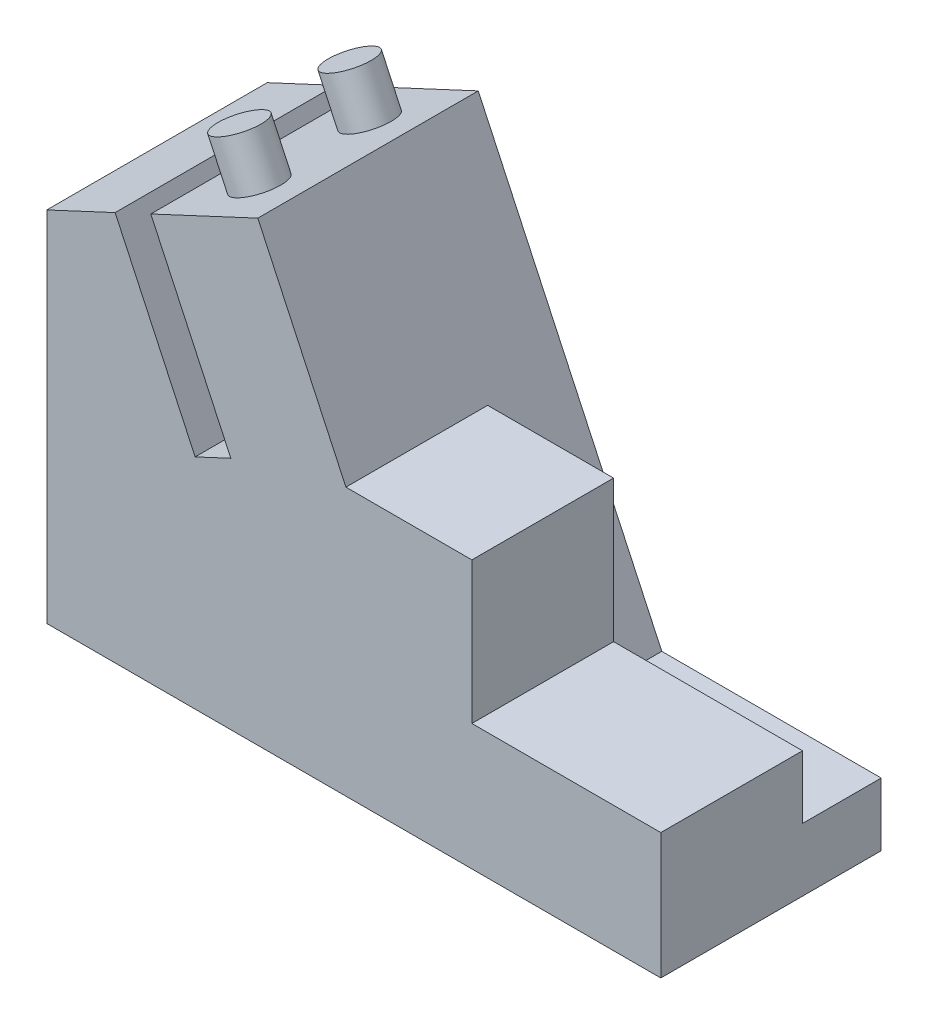
ISO-10303-21;
HEADER;
FILE_DESCRIPTION(('STEP AP214'),'2;1');
FILE_NAME('part.step','',(''),(''),'','','');
FILE_SCHEMA(('AUTOMOTIVE_DESIGN { 1 0 10303 214 1 1 1 1 }'));
ENDSEC;
DATA;
#1=APPLICATION_CONTEXT('core data for automotive mechanical design processes');
#2=APPLICATION_PROTOCOL_DEFINITION('international standard','automotive_design',2000,#1);
#3=PRODUCT_CONTEXT('',#1,'mechanical');
#4=PRODUCT('Part','Part','',(#3));
#5=PRODUCT_RELATED_PRODUCT_CATEGORY('part','',(#4));
#6=PRODUCT_DEFINITION_FORMATION('','',#4);
#7=PRODUCT_DEFINITION_CONTEXT('part definition',#1,'design');
#8=PRODUCT_DEFINITION('design','',#6,#7);
#9=PRODUCT_DEFINITION_SHAPE('','',#8);
#10=(LENGTH_UNIT() NAMED_UNIT(*) SI_UNIT(.MILLI.,.METRE.));
#11=(NAMED_UNIT(*) PLANE_ANGLE_UNIT() SI_UNIT($,.RADIAN.));
#12=(NAMED_UNIT(*) SI_UNIT($,.STERADIAN.) SOLID_ANGLE_UNIT());
#13=UNCERTAINTY_MEASURE_WITH_UNIT(LENGTH_MEASURE(1.E-05),#10,'distance_accuracy_value','');
#14=(GEOMETRIC_REPRESENTATION_CONTEXT(3) GLOBAL_UNCERTAINTY_ASSIGNED_CONTEXT((#13)) GLOBAL_UNIT_ASSIGNED_CONTEXT((#10,
#11,#12)) REPRESENTATION_CONTEXT('',''));
#15=CARTESIAN_POINT('',(0.,0.,0.));
#16=DIRECTION('',(0.,0.,1.));
#17=DIRECTION('',(1.,0.,0.));
#18=AXIS2_PLACEMENT_3D('',#15,#16,#17);
#19=CARTESIAN_POINT('',(0.,34.,-18.));
#20=DIRECTION('',(0.,1.,0.));
#21=DIRECTION('',(-1.,0.,0.));
#22=AXIS2_PLACEMENT_3D('',#19,#20,#21);
#23=PLANE('',#22);
#24=DIRECTION('',(-1.,0.,0.));
#25=VECTOR('',#24,1.);
#26=CARTESIAN_POINT('',(0.,34.,0.));
#27=LINE('',#26,#25);
#28=CARTESIAN_POINT('',(-24.,34.,0.));
#29=VERTEX_POINT('',#28);
#30=CARTESIAN_POINT('',(-40.,34.,0.));
#31=VERTEX_POINT('',#30);
#32=EDGE_CURVE('E124',#29,#31,#27,.T.);
#33=ORIENTED_EDGE('',*,*,#32,.F.);
#34=DIRECTION('',(0.,0.,1.));
#35=VECTOR('',#34,1.);
#36=CARTESIAN_POINT('',(-24.,34.,-18.));
#37=LINE('',#36,#35);
#38=CARTESIAN_POINT('',(-24.,34.,-18.));
#39=VERTEX_POINT('',#38);
#40=EDGE_CURVE('E47',#39,#29,#37,.T.);
#41=ORIENTED_EDGE('',*,*,#40,.F.);
#42=DIRECTION('',(-1.,0.,0.));
#43=VECTOR('',#42,1.);
#44=CARTESIAN_POINT('',(0.,34.,-18.));
#45=LINE('',#44,#43);
#46=CARTESIAN_POINT('',(-40.,34.,-18.));
#47=VERTEX_POINT('',#46);
#48=EDGE_CURVE('E104',#39,#47,#45,.T.);
#49=ORIENTED_EDGE('',*,*,#48,.T.);
#50=DIRECTION('',(0.,0.,1.));
#51=VECTOR('',#50,1.);
#52=CARTESIAN_POINT('',(-40.,34.,-18.));
#53=LINE('',#52,#51);
#54=EDGE_CURVE('E11',#47,#31,#53,.T.);
#55=ORIENTED_EDGE('',*,*,#54,.T.);
#56=EDGE_LOOP('',(#33,#41,#49,#55));
#57=FACE_BOUND('',#56,.T.);
#58=ADVANCED_FACE('F39',(#57),#23,.T.);
#59=CARTESIAN_POINT('',(-24.,0.,-18.));
#60=DIRECTION('',(1.,0.,0.));
#61=DIRECTION('',(0.,0.,-1.));
#62=AXIS2_PLACEMENT_3D('',#59,#60,#61);
#63=PLANE('',#62);
#64=DIRECTION('',(0.,1.,0.));
#65=VECTOR('',#64,1.);
#66=CARTESIAN_POINT('',(-24.,0.,0.));
#67=LINE('',#66,#65);
#68=CARTESIAN_POINT('',(-24.,16.,0.));
#69=VERTEX_POINT('',#68);
#70=EDGE_CURVE('E96',#69,#29,#67,.T.);
#71=ORIENTED_EDGE('',*,*,#70,.F.);
#72=DIRECTION('',(0.,0.,1.));
#73=VECTOR('',#72,1.);
#74=CARTESIAN_POINT('',(-24.,16.,-18.));
#75=LINE('',#74,#73);
#76=CARTESIAN_POINT('',(-24.,16.,-18.));
#77=VERTEX_POINT('',#76);
#78=EDGE_CURVE('E95',#77,#69,#75,.T.);
#79=ORIENTED_EDGE('',*,*,#78,.F.);
#80=DIRECTION('',(0.,1.,0.));
#81=VECTOR('',#80,1.);
#82=CARTESIAN_POINT('',(-24.,0.,-18.));
#83=LINE('',#82,#81);
#84=EDGE_CURVE('E92',#77,#39,#83,.T.);
#85=ORIENTED_EDGE('',*,*,#84,.T.);
#86=ORIENTED_EDGE('',*,*,#40,.T.);
#87=EDGE_LOOP('',(#71,#79,#85,#86));
#88=FACE_BOUND('',#87,.T.);
#89=ADVANCED_FACE('F94',(#88),#63,.T.);
#90=CARTESIAN_POINT('',(0.,16.,-18.));
#91=DIRECTION('',(0.,1.,0.));
#92=DIRECTION('',(-1.,0.,0.));
#93=AXIS2_PLACEMENT_3D('',#90,#91,#92);
#94=PLANE('',#93);
#95=DIRECTION('',(-1.,0.,0.));
#96=VECTOR('',#95,1.);
#97=CARTESIAN_POINT('',(0.,16.,0.));
#98=LINE('',#97,#96);
#99=CARTESIAN_POINT('',(0.,16.,0.));
#100=VERTEX_POINT('',#99);
#101=EDGE_CURVE('E120',#100,#69,#98,.T.);
#102=ORIENTED_EDGE('',*,*,#101,.F.);
#103=DIRECTION('',(0.,0.,1.));
#104=VECTOR('',#103,1.);
#105=CARTESIAN_POINT('',(0.,16.,-18.));
#106=LINE('',#105,#104);
#107=CARTESIAN_POINT('',(0.,16.,-18.));
#108=VERTEX_POINT('',#107);
#109=EDGE_CURVE('E43',#108,#100,#106,.T.);
#110=ORIENTED_EDGE('',*,*,#109,.F.);
#111=DIRECTION('',(-1.,0.,0.));
#112=VECTOR('',#111,1.);
#113=CARTESIAN_POINT('',(0.,16.,-18.));
#114=LINE('',#113,#112);
#115=EDGE_CURVE('E103',#108,#77,#114,.T.);
#116=ORIENTED_EDGE('',*,*,#115,.T.);
#117=ORIENTED_EDGE('',*,*,#78,.T.);
#118=EDGE_LOOP('',(#102,#110,#116,#117));
#119=FACE_BOUND('',#118,.T.);
#120=ADVANCED_FACE('F110',(#119),#94,.T.);
#121=CARTESIAN_POINT('',(0.,0.,-18.));
#122=DIRECTION('',(1.,0.,0.));
#123=DIRECTION('',(0.,0.,-1.));
#124=AXIS2_PLACEMENT_3D('',#121,#122,#123);
#125=PLANE('',#124);
#126=DIRECTION('',(0.,1.,0.));
#127=VECTOR('',#126,1.);
#128=CARTESIAN_POINT('',(0.,0.,0.));
#129=LINE('',#128,#127);
#130=CARTESIAN_POINT('',(0.,0.,0.));
#131=VERTEX_POINT('',#130);
#132=EDGE_CURVE('E111',#131,#100,#129,.T.);
#133=ORIENTED_EDGE('',*,*,#132,.F.);
#134=DIRECTION('',(0.,0.,1.));
#135=VECTOR('',#134,1.);
#136=CARTESIAN_POINT('',(0.,0.,-28.));
#137=LINE('',#136,#135);
#138=CARTESIAN_POINT('',(0.,0.,-28.));
#139=VERTEX_POINT('',#138);
#140=EDGE_CURVE('E153',#139,#131,#137,.T.);
#141=ORIENTED_EDGE('',*,*,#140,.F.);
#142=DIRECTION('',(0.,1.,0.));
#143=VECTOR('',#142,1.);
#144=CARTESIAN_POINT('',(0.,0.,-28.));
#145=LINE('',#144,#143);
#146=CARTESIAN_POINT('',(0.,8.,-28.));
#147=VERTEX_POINT('',#146);
#148=EDGE_CURVE('E190',#139,#147,#145,.T.);
#149=ORIENTED_EDGE('',*,*,#148,.T.);
#150=DIRECTION('',(0.,0.,1.));
#151=VECTOR('',#150,1.);
#152=CARTESIAN_POINT('',(0.,8.,-28.));
#153=LINE('',#152,#151);
#154=CARTESIAN_POINT('',(0.,8.,-18.));
#155=VERTEX_POINT('',#154);
#156=EDGE_CURVE('E156',#147,#155,#153,.T.);
#157=ORIENTED_EDGE('',*,*,#156,.T.);
#158=DIRECTION('',(0.,1.,0.));
#159=VECTOR('',#158,1.);
#160=CARTESIAN_POINT('',(0.,0.,-18.));
#161=LINE('',#160,#159);
#162=EDGE_CURVE('E107',#155,#108,#161,.T.);
#163=ORIENTED_EDGE('',*,*,#162,.T.);
#164=ORIENTED_EDGE('',*,*,#109,.T.);
#165=EDGE_LOOP('',(#133,#141,#149,#157,#163,#164));
#166=FACE_BOUND('',#165,.T.);
#167=ADVANCED_FACE('F41',(#166),#125,.T.);
#168=CARTESIAN_POINT('',(0.,0.,-18.));
#169=DIRECTION('',(0.,0.,1.));
#170=DIRECTION('',(1.,0.,0.));
#171=AXIS2_PLACEMENT_3D('',#168,#169,#170);
#172=PLANE('',#171);
#173=DIRECTION('',(0.422618261740704,-0.906307787036648,0.));
#174=VECTOR('',#173,1.);
#175=CARTESIAN_POINT('',(-19.8329966607079,-9.24827822705073,-18.));
#176=LINE('',#175,#174);
#177=CARTESIAN_POINT('',(-27.8760008879699,8.,-18.));
#178=VERTEX_POINT('',#177);
#179=EDGE_CURVE('E59',#47,#178,#176,.T.);
#180=ORIENTED_EDGE('',*,*,#179,.F.);
#181=ORIENTED_EDGE('',*,*,#48,.F.);
#182=ORIENTED_EDGE('',*,*,#84,.F.);
#183=ORIENTED_EDGE('',*,*,#115,.F.);
#184=ORIENTED_EDGE('',*,*,#162,.F.);
#185=DIRECTION('',(1.,0.,0.));
#186=VECTOR('',#185,1.);
#187=CARTESIAN_POINT('',(0.,8.,-18.));
#188=LINE('',#187,#186);
#189=EDGE_CURVE('E88',#178,#155,#188,.T.);
#190=ORIENTED_EDGE('',*,*,#189,.F.);
#191=EDGE_LOOP('',(#180,#181,#182,#183,#184,#190));
#192=FACE_BOUND('',#191,.T.);
#193=ADVANCED_FACE('F105',(#192),#172,.F.);
#194=CARTESIAN_POINT('',(0.,0.,0.));
#195=DIRECTION('',(0.,0.,1.));
#196=DIRECTION('',(1.,0.,0.));
#197=AXIS2_PLACEMENT_3D('',#194,#195,#196);
#198=PLANE('',#197);
#199=ORIENTED_EDGE('',*,*,#32,.T.);
#200=DIRECTION('',(0.422618261740704,-0.906307787036648,0.));
#201=VECTOR('',#200,1.);
#202=CARTESIAN_POINT('',(-19.8329966607079,-9.24827822705073,0.));
#203=LINE('',#202,#201);
#204=CARTESIAN_POINT('',(-51.1913837957201,58.,0.));
#205=VERTEX_POINT('',#204);
#206=EDGE_CURVE('E185',#205,#31,#203,.T.);
#207=ORIENTED_EDGE('',*,*,#206,.F.);
#208=DIRECTION('',(-0.906307787036648,-0.422618261740705,0.));
#209=VECTOR('',#208,1.);
#210=CARTESIAN_POINT('',(-31.3583871350123,67.2482782270507,0.));
#211=LINE('',#210,#209);
#212=CARTESIAN_POINT('',(-64.7860006012698,51.6607260738894,0.));
#213=VERTEX_POINT('',#212);
#214=EDGE_CURVE('E178',#205,#213,#211,.T.);
#215=ORIENTED_EDGE('',*,*,#214,.T.);
#216=DIRECTION('',(0.422618261740705,-0.906307787036648,0.));
#217=VECTOR('',#216,1.);
#218=CARTESIAN_POINT('',(-33.4276134662576,-15.5875521531613,0.));
#219=LINE('',#218,#217);
#220=CARTESIAN_POINT('',(-54.6226789554111,29.8654124689811,0.));
#221=VERTEX_POINT('',#220);
#222=EDGE_CURVE('E179',#213,#221,#219,.T.);
#223=ORIENTED_EDGE('',*,*,#222,.T.);
#224=DIRECTION('',(-0.906307787036647,-0.422618261740705,0.));
#225=VECTOR('',#224,1.);
#226=CARTESIAN_POINT('',(-21.1950654891536,45.4529646221424,0.));
#227=LINE('',#226,#225);
#228=CARTESIAN_POINT('',(-59.1542178905944,27.7523211602776,0.));
#229=VERTEX_POINT('',#228);
#230=EDGE_CURVE('E172',#221,#229,#227,.T.);
#231=ORIENTED_EDGE('',*,*,#230,.T.);
#232=DIRECTION('',(-0.422618261740705,0.906307787036647,0.));
#233=VECTOR('',#232,1.);
#234=CARTESIAN_POINT('',(-37.9591524014407,-17.7006434618648,0.));
#235=LINE('',#234,#233);
#236=CARTESIAN_POINT('',(-69.3175395364531,49.5476347651859,0.));
#237=VERTEX_POINT('',#236);
#238=EDGE_CURVE('E168',#229,#237,#235,.T.);
#239=ORIENTED_EDGE('',*,*,#238,.T.);
#240=DIRECTION('',(-0.906307787036647,-0.422618261740705,0.));
#241=VECTOR('',#240,1.);
#242=CARTESIAN_POINT('',(-31.3583871350124,67.2482782270507,0.));
#243=LINE('',#242,#241);
#244=CARTESIAN_POINT('',(-78.,45.4989369594059,0.));
#245=VERTEX_POINT('',#244);
#246=EDGE_CURVE('E170',#237,#245,#243,.T.);
#247=ORIENTED_EDGE('',*,*,#246,.T.);
#248=DIRECTION('',(0.,1.,0.));
#249=VECTOR('',#248,1.);
#250=CARTESIAN_POINT('',(-78.,0.,0.));
#251=LINE('',#250,#249);
#252=CARTESIAN_POINT('',(-78.,0.,0.));
#253=VERTEX_POINT('',#252);
#254=EDGE_CURVE('E163',#253,#245,#251,.T.);
#255=ORIENTED_EDGE('',*,*,#254,.F.);
#256=DIRECTION('',(-1.,0.,0.));
#257=VECTOR('',#256,1.);
#258=CARTESIAN_POINT('',(0.,0.,0.));
#259=LINE('',#258,#257);
#260=EDGE_CURVE('E159',#131,#253,#259,.T.);
#261=ORIENTED_EDGE('',*,*,#260,.F.);
#262=ORIENTED_EDGE('',*,*,#132,.T.);
#263=ORIENTED_EDGE('',*,*,#101,.T.);
#264=ORIENTED_EDGE('',*,*,#70,.T.);
#265=EDGE_LOOP('',(#199,#207,#215,#223,#231,#239,#247,#255,#261,#262,#263,#264));
#266=FACE_BOUND('',#265,.T.);
#267=ADVANCED_FACE('F253',(#266),#198,.T.);
#268=CARTESIAN_POINT('',(0.,8.,-28.));
#269=DIRECTION('',(0.,-1.,0.));
#270=DIRECTION('',(0.,0.,-1.));
#271=AXIS2_PLACEMENT_3D('',#268,#269,#270);
#272=PLANE('',#271);
#273=DIRECTION('',(0.,0.,1.));
#274=VECTOR('',#273,1.);
#275=CARTESIAN_POINT('',(-27.8760008879699,8.,-28.));
#276=LINE('',#275,#274);
#277=CARTESIAN_POINT('',(-27.8760008879699,8.,-28.));
#278=VERTEX_POINT('',#277);
#279=EDGE_CURVE('E117',#278,#178,#276,.T.);
#280=ORIENTED_EDGE('',*,*,#279,.T.);
#281=ORIENTED_EDGE('',*,*,#189,.T.);
#282=ORIENTED_EDGE('',*,*,#156,.F.);
#283=DIRECTION('',(1.,0.,0.));
#284=VECTOR('',#283,1.);
#285=CARTESIAN_POINT('',(0.,8.,-28.));
#286=LINE('',#285,#284);
#287=EDGE_CURVE('E134',#278,#147,#286,.T.);
#288=ORIENTED_EDGE('',*,*,#287,.F.);
#289=EDGE_LOOP('',(#280,#281,#282,#288));
#290=FACE_BOUND('',#289,.T.);
#291=ADVANCED_FACE('F295',(#290),#272,.F.);
#292=CARTESIAN_POINT('',(-19.8329966607079,-9.24827822705073,-28.));
#293=DIRECTION('',(-0.906307787036648,-0.422618261740704,0.));
#294=DIRECTION('',(0.422618261740704,-0.906307787036648,0.));
#295=AXIS2_PLACEMENT_3D('',#292,#293,#294);
#296=PLANE('',#295);
#297=ORIENTED_EDGE('',*,*,#54,.F.);
#298=ORIENTED_EDGE('',*,*,#179,.T.);
#299=ORIENTED_EDGE('',*,*,#279,.F.);
#300=DIRECTION('',(0.422618261740704,-0.906307787036648,0.));
#301=VECTOR('',#300,1.);
#302=CARTESIAN_POINT('',(-19.8329966607079,-9.24827822705073,-28.));
#303=LINE('',#302,#301);
#304=CARTESIAN_POINT('',(-51.1913837957201,58.,-28.));
#305=VERTEX_POINT('',#304);
#306=EDGE_CURVE('E162',#305,#278,#303,.T.);
#307=ORIENTED_EDGE('',*,*,#306,.F.);
#308=DIRECTION('',(0.,0.,1.));
#309=VECTOR('',#308,1.);
#310=CARTESIAN_POINT('',(-51.1913837957201,58.,-28.));
#311=LINE('',#310,#309);
#312=EDGE_CURVE('E131',#305,#205,#311,.T.);
#313=ORIENTED_EDGE('',*,*,#312,.T.);
#314=ORIENTED_EDGE('',*,*,#206,.T.);
#315=EDGE_LOOP('',(#297,#298,#299,#307,#313,#314));
#316=FACE_BOUND('',#315,.T.);
#317=ADVANCED_FACE('F298',(#316),#296,.F.);
#318=CARTESIAN_POINT('',(0.,0.,-28.));
#319=DIRECTION('',(0.,1.,0.));
#320=DIRECTION('',(-1.,0.,0.));
#321=AXIS2_PLACEMENT_3D('',#318,#319,#320);
#322=PLANE('',#321);
#323=ORIENTED_EDGE('',*,*,#260,.T.);
#324=DIRECTION('',(0.,0.,1.));
#325=VECTOR('',#324,1.);
#326=CARTESIAN_POINT('',(-78.,0.,-28.));
#327=LINE('',#326,#325);
#328=CARTESIAN_POINT('',(-78.,0.,-28.));
#329=VERTEX_POINT('',#328);
#330=EDGE_CURVE('E147',#329,#253,#327,.T.);
#331=ORIENTED_EDGE('',*,*,#330,.F.);
#332=DIRECTION('',(-1.,0.,0.));
#333=VECTOR('',#332,1.);
#334=CARTESIAN_POINT('',(0.,0.,-28.));
#335=LINE('',#334,#333);
#336=EDGE_CURVE('E189',#139,#329,#335,.T.);
#337=ORIENTED_EDGE('',*,*,#336,.F.);
#338=ORIENTED_EDGE('',*,*,#140,.T.);
#339=EDGE_LOOP('',(#323,#331,#337,#338));
#340=FACE_BOUND('',#339,.T.);
#341=ADVANCED_FACE('F304',(#340),#322,.F.);
#342=CARTESIAN_POINT('',(-78.,0.,-28.));
#343=DIRECTION('',(1.,0.,0.));
#344=DIRECTION('',(0.,0.,-1.));
#345=AXIS2_PLACEMENT_3D('',#342,#343,#344);
#346=PLANE('',#345);
#347=ORIENTED_EDGE('',*,*,#254,.T.);
#348=DIRECTION('',(0.,0.,1.));
#349=VECTOR('',#348,1.);
#350=CARTESIAN_POINT('',(-78.,45.4989369594059,-28.));
#351=LINE('',#350,#349);
#352=CARTESIAN_POINT('',(-78.,45.4989369594059,-28.));
#353=VERTEX_POINT('',#352);
#354=EDGE_CURVE('E150',#353,#245,#351,.T.);
#355=ORIENTED_EDGE('',*,*,#354,.F.);
#356=DIRECTION('',(0.,1.,0.));
#357=VECTOR('',#356,1.);
#358=CARTESIAN_POINT('',(-78.,0.,-28.));
#359=LINE('',#358,#357);
#360=EDGE_CURVE('E195',#329,#353,#359,.T.);
#361=ORIENTED_EDGE('',*,*,#360,.F.);
#362=ORIENTED_EDGE('',*,*,#330,.T.);
#363=EDGE_LOOP('',(#347,#355,#361,#362));
#364=FACE_BOUND('',#363,.T.);
#365=ADVANCED_FACE('F307',(#364),#346,.F.);
#366=CARTESIAN_POINT('',(-31.3583871350124,67.2482782270507,-28.));
#367=DIRECTION('',(-0.422618261740705,0.906307787036647,0.));
#368=DIRECTION('',(-0.906307787036647,-0.422618261740705,0.));
#369=AXIS2_PLACEMENT_3D('',#366,#367,#368);
#370=PLANE('',#369);
#371=ORIENTED_EDGE('',*,*,#246,.F.);
#372=DIRECTION('',(0.,0.,1.));
#373=VECTOR('',#372,1.);
#374=CARTESIAN_POINT('',(-69.3175395364531,49.5476347651859,-28.));
#375=LINE('',#374,#373);
#376=CARTESIAN_POINT('',(-69.3175395364531,49.5476347651859,-28.));
#377=VERTEX_POINT('',#376);
#378=EDGE_CURVE('E145',#377,#237,#375,.T.);
#379=ORIENTED_EDGE('',*,*,#378,.F.);
#380=DIRECTION('',(-0.906307787036647,-0.422618261740705,0.));
#381=VECTOR('',#380,1.);
#382=CARTESIAN_POINT('',(-31.3583871350124,67.2482782270507,-28.));
#383=LINE('',#382,#381);
#384=EDGE_CURVE('E198',#377,#353,#383,.T.);
#385=ORIENTED_EDGE('',*,*,#384,.T.);
#386=ORIENTED_EDGE('',*,*,#354,.T.);
#387=EDGE_LOOP('',(#371,#379,#385,#386));
#388=FACE_BOUND('',#387,.T.);
#389=ADVANCED_FACE('F361',(#388),#370,.T.);
#390=CARTESIAN_POINT('',(-37.9591524014407,-17.7006434618648,-28.));
#391=DIRECTION('',(0.906307787036647,0.422618261740705,0.));
#392=DIRECTION('',(-0.422618261740705,0.906307787036647,0.));
#393=AXIS2_PLACEMENT_3D('',#390,#391,#392);
#394=PLANE('',#393);
#395=ORIENTED_EDGE('',*,*,#238,.F.);
#396=DIRECTION('',(0.,0.,1.));
#397=VECTOR('',#396,1.);
#398=CARTESIAN_POINT('',(-59.1542178905944,27.7523211602776,-28.));
#399=LINE('',#398,#397);
#400=CARTESIAN_POINT('',(-59.1542178905944,27.7523211602776,-28.));
#401=VERTEX_POINT('',#400);
#402=EDGE_CURVE('E143',#401,#229,#399,.T.);
#403=ORIENTED_EDGE('',*,*,#402,.F.);
#404=DIRECTION('',(-0.422618261740705,0.906307787036647,0.));
#405=VECTOR('',#404,1.);
#406=CARTESIAN_POINT('',(-37.9591524014407,-17.7006434618648,-28.));
#407=LINE('',#406,#405);
#408=EDGE_CURVE('E200',#401,#377,#407,.T.);
#409=ORIENTED_EDGE('',*,*,#408,.T.);
#410=ORIENTED_EDGE('',*,*,#378,.T.);
#411=EDGE_LOOP('',(#395,#403,#409,#410));
#412=FACE_BOUND('',#411,.T.);
#413=ADVANCED_FACE('F373',(#412),#394,.T.);
#414=CARTESIAN_POINT('',(-21.1950654891536,45.4529646221424,-28.));
#415=DIRECTION('',(-0.422618261740705,0.906307787036647,0.));
#416=DIRECTION('',(-0.906307787036647,-0.422618261740705,0.));
#417=AXIS2_PLACEMENT_3D('',#414,#415,#416);
#418=PLANE('',#417);
#419=ORIENTED_EDGE('',*,*,#230,.F.);
#420=DIRECTION('',(0.,0.,1.));
#421=VECTOR('',#420,1.);
#422=CARTESIAN_POINT('',(-54.6226789554111,29.8654124689811,-28.));
#423=LINE('',#422,#421);
#424=CARTESIAN_POINT('',(-54.6226789554111,29.8654124689811,-28.));
#425=VERTEX_POINT('',#424);
#426=EDGE_CURVE('E140',#425,#221,#423,.T.);
#427=ORIENTED_EDGE('',*,*,#426,.F.);
#428=DIRECTION('',(-0.906307787036647,-0.422618261740705,0.));
#429=VECTOR('',#428,1.);
#430=CARTESIAN_POINT('',(-21.1950654891536,45.4529646221424,-28.));
#431=LINE('',#430,#429);
#432=EDGE_CURVE('E205',#425,#401,#431,.T.);
#433=ORIENTED_EDGE('',*,*,#432,.T.);
#434=ORIENTED_EDGE('',*,*,#402,.T.);
#435=EDGE_LOOP('',(#419,#427,#433,#434));
#436=FACE_BOUND('',#435,.T.);
#437=ADVANCED_FACE('F382',(#436),#418,.T.);
#438=CARTESIAN_POINT('',(-33.4276134662576,-15.5875521531613,-28.));
#439=DIRECTION('',(-0.906307787036648,-0.422618261740705,0.));
#440=DIRECTION('',(0.422618261740705,-0.906307787036648,0.));
#441=AXIS2_PLACEMENT_3D('',#438,#439,#440);
#442=PLANE('',#441);
#443=ORIENTED_EDGE('',*,*,#222,.F.);
#444=DIRECTION('',(0.,0.,1.));
#445=VECTOR('',#444,1.);
#446=CARTESIAN_POINT('',(-64.7860006012698,51.6607260738894,-28.));
#447=LINE('',#446,#445);
#448=CARTESIAN_POINT('',(-64.7860006012698,51.6607260738894,-28.));
#449=VERTEX_POINT('',#448);
#450=EDGE_CURVE('E133',#449,#213,#447,.T.);
#451=ORIENTED_EDGE('',*,*,#450,.F.);
#452=DIRECTION('',(0.422618261740705,-0.906307787036648,0.));
#453=VECTOR('',#452,1.);
#454=CARTESIAN_POINT('',(-33.4276134662576,-15.5875521531613,-28.));
#455=LINE('',#454,#453);
#456=EDGE_CURVE('E202',#449,#425,#455,.T.);
#457=ORIENTED_EDGE('',*,*,#456,.T.);
#458=ORIENTED_EDGE('',*,*,#426,.T.);
#459=EDGE_LOOP('',(#443,#451,#457,#458));
#460=FACE_BOUND('',#459,.T.);
#461=ADVANCED_FACE('F236',(#460),#442,.T.);
#462=CARTESIAN_POINT('',(-31.3583871350123,67.2482782270507,-28.));
#463=DIRECTION('',(-0.422618261740705,0.906307787036648,0.));
#464=DIRECTION('',(-0.906307787036648,-0.422618261740705,0.));
#465=AXIS2_PLACEMENT_3D('',#462,#463,#464);
#466=PLANE('',#465);
#467=CARTESIAN_POINT('',(-57.988692198495,54.8303630369447,-7.));
#468=DIRECTION('',(-0.422618261740705,0.906307787036647,0.));
#469=DIRECTION('',(-0.906307787036647,-0.422618261740705,0.));
#470=AXIS2_PLACEMENT_3D('',#467,#468,#469);
#471=CIRCLE('',#470,3.00000000000001);
#472=CARTESIAN_POINT('',(-55.269768837385,56.0982178221668,-7.));
#473=VERTEX_POINT('',#472);
#474=EDGE_CURVE('E218',#473,#473,#471,.T.);
#475=ORIENTED_EDGE('',*,*,#474,.F.);
#476=EDGE_LOOP('',(#475));
#477=FACE_BOUND('',#476,.T.);
#478=CARTESIAN_POINT('',(-57.988692198495,54.8303630369447,-21.));
#479=DIRECTION('',(-0.422618261740705,0.906307787036647,0.));
#480=DIRECTION('',(-0.906307787036647,-0.422618261740705,0.));
#481=AXIS2_PLACEMENT_3D('',#478,#479,#480);
#482=CIRCLE('',#481,3.00000000000001);
#483=CARTESIAN_POINT('',(-55.269768837385,56.0982178221668,-21.));
#484=VERTEX_POINT('',#483);
#485=EDGE_CURVE('E216',#484,#484,#482,.T.);
#486=ORIENTED_EDGE('',*,*,#485,.F.);
#487=EDGE_LOOP('',(#486));
#488=FACE_BOUND('',#487,.T.);
#489=ORIENTED_EDGE('',*,*,#214,.F.);
#490=ORIENTED_EDGE('',*,*,#312,.F.);
#491=DIRECTION('',(-0.906307787036648,-0.422618261740705,0.));
#492=VECTOR('',#491,1.);
#493=CARTESIAN_POINT('',(-31.3583871350123,67.2482782270507,-28.));
#494=LINE('',#493,#492);
#495=EDGE_CURVE('E208',#305,#449,#494,.T.);
#496=ORIENTED_EDGE('',*,*,#495,.T.);
#497=ORIENTED_EDGE('',*,*,#450,.T.);
#498=EDGE_LOOP('',(#489,#490,#496,#497));
#499=FACE_BOUND('',#498,.T.);
#500=ADVANCED_FACE('F233',(#477,#488,#499),#466,.T.);
#501=CARTESIAN_POINT('',(0.,0.,-28.));
#502=DIRECTION('',(0.,0.,1.));
#503=DIRECTION('',(1.,0.,0.));
#504=AXIS2_PLACEMENT_3D('',#501,#502,#503);
#505=PLANE('',#504);
#506=ORIENTED_EDGE('',*,*,#306,.T.);
#507=ORIENTED_EDGE('',*,*,#287,.T.);
#508=ORIENTED_EDGE('',*,*,#148,.F.);
#509=ORIENTED_EDGE('',*,*,#336,.T.);
#510=ORIENTED_EDGE('',*,*,#360,.T.);
#511=ORIENTED_EDGE('',*,*,#384,.F.);
#512=ORIENTED_EDGE('',*,*,#408,.F.);
#513=ORIENTED_EDGE('',*,*,#432,.F.);
#514=ORIENTED_EDGE('',*,*,#456,.F.);
#515=ORIENTED_EDGE('',*,*,#495,.F.);
#516=EDGE_LOOP('',(#506,#507,#508,#509,#510,#511,#512,#513,#514,#515));
#517=FACE_BOUND('',#516,.T.);
#518=ADVANCED_FACE('F240',(#517),#505,.F.);
#519=CARTESIAN_POINT('',(-60.5244017689392,60.2682097591646,-21.));
#520=DIRECTION('',(0.422618261740705,-0.906307787036647,0.));
#521=DIRECTION('',(0.906307787036647,0.422618261740705,0.));
#522=AXIS2_PLACEMENT_3D('',#519,#520,#521);
#523=CYLINDRICAL_SURFACE('',#522,3.00000000000001);
#524=CARTESIAN_POINT('',(-60.5244017689392,60.2682097591646,-21.));
#525=DIRECTION('',(-0.422618261740705,0.906307787036647,0.));
#526=DIRECTION('',(-0.906307787036647,-0.422618261740705,0.));
#527=AXIS2_PLACEMENT_3D('',#524,#525,#526);
#528=CIRCLE('',#527,3.00000000000001);
#529=CARTESIAN_POINT('',(-57.8054784078293,61.5360645443867,-21.));
#530=VERTEX_POINT('',#529);
#531=EDGE_CURVE('E213',#530,#530,#528,.T.);
#532=CARTESIAN_POINT('',(-57.8054784078293,61.5360645443867,-21.));
#533=CARTESIAN_POINT('',(-57.7790647664705,61.4794203076969,-21.));
#534=CARTESIAN_POINT('',(-57.7526511251117,61.4227760710071,-21.));
#535=CARTESIAN_POINT('',(-57.6998238423941,61.3094875976275,-21.));
#536=CARTESIAN_POINT('',(-57.6734102010353,61.2528433609378,-21.));
#537=CARTESIAN_POINT('',(-57.6205829183177,61.1395548875582,-21.));
#538=CARTESIAN_POINT('',(-57.5941692769589,61.0829106508684,-21.));
#539=CARTESIAN_POINT('',(-57.5413419942413,60.9696221774888,-21.));
#540=CARTESIAN_POINT('',(-57.5149283528825,60.912977940799,-21.));
#541=CARTESIAN_POINT('',(-57.4621010701649,60.7996894674194,-21.));
#542=CARTESIAN_POINT('',(-57.4356874288062,60.7430452307296,-21.));
#543=CARTESIAN_POINT('',(-57.3828601460886,60.6297567573501,-21.));
#544=CARTESIAN_POINT('',(-57.3564465047298,60.5731125206603,-21.));
#545=CARTESIAN_POINT('',(-57.3036192220122,60.4598240472807,-21.));
#546=CARTESIAN_POINT('',(-57.2772055806534,60.4031798105909,-21.));
#547=CARTESIAN_POINT('',(-57.2243782979358,60.2898913372113,-21.));
#548=CARTESIAN_POINT('',(-57.197964656577,60.2332471005215,-21.));
#549=CARTESIAN_POINT('',(-57.1451373738594,60.1199586271419,-21.));
#550=CARTESIAN_POINT('',(-57.1187237325006,60.0633143904522,-21.));
#551=CARTESIAN_POINT('',(-57.065896449783,59.9500259170726,-21.));
#552=CARTESIAN_POINT('',(-57.0394828084242,59.8933816803828,-21.));
#553=CARTESIAN_POINT('',(-56.9866555257067,59.7800932070032,-21.));
#554=CARTESIAN_POINT('',(-56.9602418843479,59.7234489703134,-21.));
#555=CARTESIAN_POINT('',(-56.9074146016303,59.6101604969338,-21.));
#556=CARTESIAN_POINT('',(-56.8810009602715,59.553516260244,-21.));
#557=CARTESIAN_POINT('',(-56.8281736775539,59.4402277868645,-21.));
#558=CARTESIAN_POINT('',(-56.8017600361951,59.3835835501747,-21.));
#559=CARTESIAN_POINT('',(-56.7489327534775,59.2702950767951,-21.));
#560=CARTESIAN_POINT('',(-56.7225191121187,59.2136508401053,-21.));
#561=CARTESIAN_POINT('',(-56.6696918294011,59.1003623667257,-21.));
#562=CARTESIAN_POINT('',(-56.6432781880423,59.0437181300359,-21.));
#563=CARTESIAN_POINT('',(-56.5904509053247,58.9304296566563,-21.));
#564=CARTESIAN_POINT('',(-56.564037263966,58.8737854199666,-21.));
#565=CARTESIAN_POINT('',(-56.5112099812484,58.760496946587,-21.));
#566=CARTESIAN_POINT('',(-56.4847963398896,58.7038527098972,-21.));
#567=CARTESIAN_POINT('',(-56.431969057172,58.5905642365176,-21.));
#568=CARTESIAN_POINT('',(-56.4055554158132,58.5339199998278,-21.));
#569=CARTESIAN_POINT('',(-56.3527281330956,58.4206315264482,-21.));
#570=CARTESIAN_POINT('',(-56.3263144917368,58.3639872897584,-21.));
#571=CARTESIAN_POINT('',(-56.2734872090192,58.2506988163789,-21.));
#572=CARTESIAN_POINT('',(-56.2470735676604,58.1940545796891,-21.));
#573=CARTESIAN_POINT('',(-56.1942462849428,58.0807661063095,-21.));
#574=CARTESIAN_POINT('',(-56.167832643584,58.0241218696197,-21.));
#575=CARTESIAN_POINT('',(-56.1150053608664,57.9108333962401,-21.));
#576=CARTESIAN_POINT('',(-56.0885917195077,57.8541891595503,-21.));
#577=CARTESIAN_POINT('',(-56.0357644367901,57.7409006861707,-21.));
#578=CARTESIAN_POINT('',(-56.0093507954313,57.684256449481,-21.));
#579=CARTESIAN_POINT('',(-55.9565235127137,57.5709679761014,-21.));
#580=CARTESIAN_POINT('',(-55.9301098713549,57.5143237394116,-21.));
#581=CARTESIAN_POINT('',(-55.8772825886373,57.401035266032,-21.));
#582=CARTESIAN_POINT('',(-55.8508689472785,57.3443910293422,-21.));
#583=CARTESIAN_POINT('',(-55.7980416645609,57.2311025559626,-21.));
#584=CARTESIAN_POINT('',(-55.7716280232021,57.1744583192728,-21.));
#585=CARTESIAN_POINT('',(-55.7188007404845,57.0611698458933,-21.));
#586=CARTESIAN_POINT('',(-55.6923870991257,57.0045256092035,-21.));
#587=CARTESIAN_POINT('',(-55.6395598164082,56.8912371358239,-21.));
#588=CARTESIAN_POINT('',(-55.6131461750494,56.8345928991341,-21.));
#589=CARTESIAN_POINT('',(-55.5603188923318,56.7213044257545,-21.));
#590=CARTESIAN_POINT('',(-55.533905250973,56.6646601890647,-21.));
#591=CARTESIAN_POINT('',(-55.4810779682554,56.5513717156851,-21.));
#592=CARTESIAN_POINT('',(-55.4546643268966,56.4947274789954,-21.));
#593=CARTESIAN_POINT('',(-55.401837044179,56.3814390056158,-21.));
#594=CARTESIAN_POINT('',(-55.3754234028202,56.324794768926,-21.));
#595=CARTESIAN_POINT('',(-55.3225961201026,56.2115062955464,-21.));
#596=CARTESIAN_POINT('',(-55.2961824787438,56.1548620588566,-21.));
#597=CARTESIAN_POINT('',(-55.269768837385,56.0982178221668,-21.));
#598=B_SPLINE_CURVE_WITH_KNOTS('',3,(#532,#533,#534,#535,#536,#537,#538,#539,#540,#541,#542,
#543,#544,#545,#546,#547,#548,#549,#550,#551,#552,#553,#554,#555,#556,#557,#558,#559,#560,#561,
#562,#563,#564,#565,#566,#567,#568,#569,#570,#571,#572,#573,#574,#575,#576,#577,#578,#579,#580,
#581,#582,#583,#584,#585,#586,#587,#588,#589,#590,#591,#592,#593,#594,#595,#596,#597),
.UNSPECIFIED.,.F.,.F.,(4,2,2,2,2,2,2,2,2,2,2,2,2,2,2,2,2,2,2,2,2,2,2,2,2,2,2,2,2,2,2,2,4),(0.,
0.187500000000006,0.375000000000002,0.562500000000008,0.750000000000005,0.937500000000001,
1.12500000000001,1.3125,1.5,1.68750000000001,1.87500000000001,2.0625,2.25,2.4375,2.625,
2.81250000000001,3.,3.1875,3.37500000000001,3.5625,3.75,3.9375,4.125,4.3125,4.50000000000001,
4.6875,4.875,5.0625,5.25,5.4375,5.625,5.8125,6.00000000000001),.UNSPECIFIED.);
#599=EDGE_CURVE('BSEAM416',#530,#484,#598,.T.);
#600=ORIENTED_EDGE('',*,*,#531,.F.);
#601=ORIENTED_EDGE('',*,*,#485,.T.);
#602=ORIENTED_EDGE('',*,*,#599,.T.);
#603=ORIENTED_EDGE('',*,*,#599,.F.);
#604=EDGE_LOOP('',(#600,#602,#601,#603));
#605=FACE_BOUND('',#604,.T.);
#606=ADVANCED_FACE('F416',(#605),#523,.T.);
#607=CARTESIAN_POINT('',(-60.5244017689392,60.2682097591646,-21.));
#608=DIRECTION('',(-0.422618261740705,0.906307787036647,0.));
#609=DIRECTION('',(-0.906307787036647,-0.422618261740705,0.));
#610=AXIS2_PLACEMENT_3D('',#607,#608,#609);
#611=PLANE('',#610);
#612=ORIENTED_EDGE('',*,*,#531,.T.);
#613=EDGE_LOOP('',(#612));
#614=FACE_BOUND('',#613,.T.);
#615=ADVANCED_FACE('F229',(#614),#611,.T.);
#616=CARTESIAN_POINT('',(-60.5244017689392,60.2682097591646,-7.));
#617=DIRECTION('',(0.422618261740705,-0.906307787036647,0.));
#618=DIRECTION('',(0.906307787036647,0.422618261740705,0.));
#619=AXIS2_PLACEMENT_3D('',#616,#617,#618);
#620=CYLINDRICAL_SURFACE('',#619,3.00000000000001);
#621=CARTESIAN_POINT('',(-60.5244017689392,60.2682097591646,-7.));
#622=DIRECTION('',(-0.422618261740705,0.906307787036647,0.));
#623=DIRECTION('',(-0.906307787036647,-0.422618261740705,0.));
#624=AXIS2_PLACEMENT_3D('',#621,#622,#623);
#625=CIRCLE('',#624,3.00000000000001);
#626=CARTESIAN_POINT('',(-57.8054784078293,61.5360645443867,-7.));
#627=VERTEX_POINT('',#626);
#628=EDGE_CURVE('E184',#627,#627,#625,.T.);
#629=CARTESIAN_POINT('',(-57.8054784078293,61.5360645443867,-7.));
#630=CARTESIAN_POINT('',(-57.7790647664705,61.4794203076969,-7.));
#631=CARTESIAN_POINT('',(-57.7526511251117,61.4227760710071,-7.));
#632=CARTESIAN_POINT('',(-57.6998238423941,61.3094875976275,-7.));
#633=CARTESIAN_POINT('',(-57.6734102010353,61.2528433609378,-7.));
#634=CARTESIAN_POINT('',(-57.6205829183177,61.1395548875582,-7.));
#635=CARTESIAN_POINT('',(-57.5941692769589,61.0829106508684,-7.));
#636=CARTESIAN_POINT('',(-57.5413419942413,60.9696221774888,-7.));
#637=CARTESIAN_POINT('',(-57.5149283528825,60.912977940799,-7.));
#638=CARTESIAN_POINT('',(-57.4621010701649,60.7996894674194,-7.));
#639=CARTESIAN_POINT('',(-57.4356874288062,60.7430452307296,-7.));
#640=CARTESIAN_POINT('',(-57.3828601460886,60.6297567573501,-7.));
#641=CARTESIAN_POINT('',(-57.3564465047298,60.5731125206603,-7.));
#642=CARTESIAN_POINT('',(-57.3036192220122,60.4598240472807,-7.));
#643=CARTESIAN_POINT('',(-57.2772055806534,60.4031798105909,-7.));
#644=CARTESIAN_POINT('',(-57.2243782979358,60.2898913372113,-7.));
#645=CARTESIAN_POINT('',(-57.197964656577,60.2332471005215,-7.));
#646=CARTESIAN_POINT('',(-57.1451373738594,60.1199586271419,-7.));
#647=CARTESIAN_POINT('',(-57.1187237325006,60.0633143904522,-7.));
#648=CARTESIAN_POINT('',(-57.065896449783,59.9500259170726,-7.));
#649=CARTESIAN_POINT('',(-57.0394828084242,59.8933816803828,-7.));
#650=CARTESIAN_POINT('',(-56.9866555257067,59.7800932070032,-7.));
#651=CARTESIAN_POINT('',(-56.9602418843479,59.7234489703134,-7.));
#652=CARTESIAN_POINT('',(-56.9074146016303,59.6101604969338,-7.));
#653=CARTESIAN_POINT('',(-56.8810009602715,59.553516260244,-7.));
#654=CARTESIAN_POINT('',(-56.8281736775539,59.4402277868645,-7.));
#655=CARTESIAN_POINT('',(-56.8017600361951,59.3835835501747,-7.));
#656=CARTESIAN_POINT('',(-56.7489327534775,59.2702950767951,-7.));
#657=CARTESIAN_POINT('',(-56.7225191121187,59.2136508401053,-7.));
#658=CARTESIAN_POINT('',(-56.6696918294011,59.1003623667257,-7.));
#659=CARTESIAN_POINT('',(-56.6432781880423,59.0437181300359,-7.));
#660=CARTESIAN_POINT('',(-56.5904509053247,58.9304296566563,-7.));
#661=CARTESIAN_POINT('',(-56.564037263966,58.8737854199666,-7.));
#662=CARTESIAN_POINT('',(-56.5112099812484,58.760496946587,-7.));
#663=CARTESIAN_POINT('',(-56.4847963398896,58.7038527098972,-7.));
#664=CARTESIAN_POINT('',(-56.431969057172,58.5905642365176,-7.));
#665=CARTESIAN_POINT('',(-56.4055554158132,58.5339199998278,-7.));
#666=CARTESIAN_POINT('',(-56.3527281330956,58.4206315264482,-7.));
#667=CARTESIAN_POINT('',(-56.3263144917368,58.3639872897584,-7.));
#668=CARTESIAN_POINT('',(-56.2734872090192,58.2506988163789,-7.));
#669=CARTESIAN_POINT('',(-56.2470735676604,58.1940545796891,-7.));
#670=CARTESIAN_POINT('',(-56.1942462849428,58.0807661063095,-7.));
#671=CARTESIAN_POINT('',(-56.167832643584,58.0241218696197,-7.));
#672=CARTESIAN_POINT('',(-56.1150053608664,57.9108333962401,-7.));
#673=CARTESIAN_POINT('',(-56.0885917195077,57.8541891595503,-7.));
#674=CARTESIAN_POINT('',(-56.0357644367901,57.7409006861707,-7.));
#675=CARTESIAN_POINT('',(-56.0093507954313,57.684256449481,-7.));
#676=CARTESIAN_POINT('',(-55.9565235127137,57.5709679761014,-7.));
#677=CARTESIAN_POINT('',(-55.9301098713549,57.5143237394116,-7.));
#678=CARTESIAN_POINT('',(-55.8772825886373,57.401035266032,-7.));
#679=CARTESIAN_POINT('',(-55.8508689472785,57.3443910293422,-7.));
#680=CARTESIAN_POINT('',(-55.7980416645609,57.2311025559626,-7.));
#681=CARTESIAN_POINT('',(-55.7716280232021,57.1744583192728,-7.));
#682=CARTESIAN_POINT('',(-55.7188007404845,57.0611698458933,-7.));
#683=CARTESIAN_POINT('',(-55.6923870991257,57.0045256092035,-7.));
#684=CARTESIAN_POINT('',(-55.6395598164082,56.8912371358239,-7.));
#685=CARTESIAN_POINT('',(-55.6131461750494,56.8345928991341,-7.));
#686=CARTESIAN_POINT('',(-55.5603188923318,56.7213044257545,-7.));
#687=CARTESIAN_POINT('',(-55.533905250973,56.6646601890647,-7.));
#688=CARTESIAN_POINT('',(-55.4810779682554,56.5513717156851,-7.));
#689=CARTESIAN_POINT('',(-55.4546643268966,56.4947274789954,-7.));
#690=CARTESIAN_POINT('',(-55.401837044179,56.3814390056158,-7.));
#691=CARTESIAN_POINT('',(-55.3754234028202,56.324794768926,-7.));
#692=CARTESIAN_POINT('',(-55.3225961201026,56.2115062955464,-7.));
#693=CARTESIAN_POINT('',(-55.2961824787438,56.1548620588566,-7.));
#694=CARTESIAN_POINT('',(-55.269768837385,56.0982178221668,-7.));
#695=B_SPLINE_CURVE_WITH_KNOTS('',3,(#629,#630,#631,#632,#633,#634,#635,#636,#637,#638,#639,
#640,#641,#642,#643,#644,#645,#646,#647,#648,#649,#650,#651,#652,#653,#654,#655,#656,#657,#658,
#659,#660,#661,#662,#663,#664,#665,#666,#667,#668,#669,#670,#671,#672,#673,#674,#675,#676,#677,
#678,#679,#680,#681,#682,#683,#684,#685,#686,#687,#688,#689,#690,#691,#692,#693,#694),
.UNSPECIFIED.,.F.,.F.,(4,2,2,2,2,2,2,2,2,2,2,2,2,2,2,2,2,2,2,2,2,2,2,2,2,2,2,2,2,2,2,2,4),(0.,
0.187500000000006,0.375000000000002,0.562500000000008,0.750000000000005,0.937500000000001,
1.12500000000001,1.3125,1.5,1.68750000000001,1.87500000000001,2.0625,2.25,2.4375,2.625,
2.81250000000001,3.,3.1875,3.37500000000001,3.5625,3.75,3.9375,4.125,4.3125,4.50000000000001,
4.6875,4.875,5.0625,5.25,5.4375,5.625,5.8125,6.00000000000001),.UNSPECIFIED.);
#696=EDGE_CURVE('BSEAM230',#627,#473,#695,.T.);
#697=ORIENTED_EDGE('',*,*,#628,.F.);
#698=ORIENTED_EDGE('',*,*,#474,.T.);
#699=ORIENTED_EDGE('',*,*,#696,.T.);
#700=ORIENTED_EDGE('',*,*,#696,.F.);
#701=EDGE_LOOP('',(#697,#699,#698,#700));
#702=FACE_BOUND('',#701,.T.);
#703=ADVANCED_FACE('F230',(#702),#620,.T.);
#704=CARTESIAN_POINT('',(-60.5244017689392,60.2682097591646,-7.));
#705=DIRECTION('',(-0.422618261740705,0.906307787036647,0.));
#706=DIRECTION('',(-0.906307787036647,-0.422618261740705,0.));
#707=AXIS2_PLACEMENT_3D('',#704,#705,#706);
#708=PLANE('',#707);
#709=ORIENTED_EDGE('',*,*,#628,.T.);
#710=EDGE_LOOP('',(#709));
#711=FACE_BOUND('',#710,.T.);
#712=ADVANCED_FACE('F223',(#711),#708,.T.);
#713=CLOSED_SHELL('',(#58,#89,#120,#167,#193,#267,#291,#317,#341,#365,#389,#413,#437,#461,#500,
#518,#606,#615,#703,#712));
#714=MANIFOLD_SOLID_BREP('B2',#713);
#715=ADVANCED_BREP_SHAPE_REPRESENTATION('',(#18,#714),#14);
#716=SHAPE_DEFINITION_REPRESENTATION(#9,#715);
ENDSEC;
END-ISO-10303-21;
